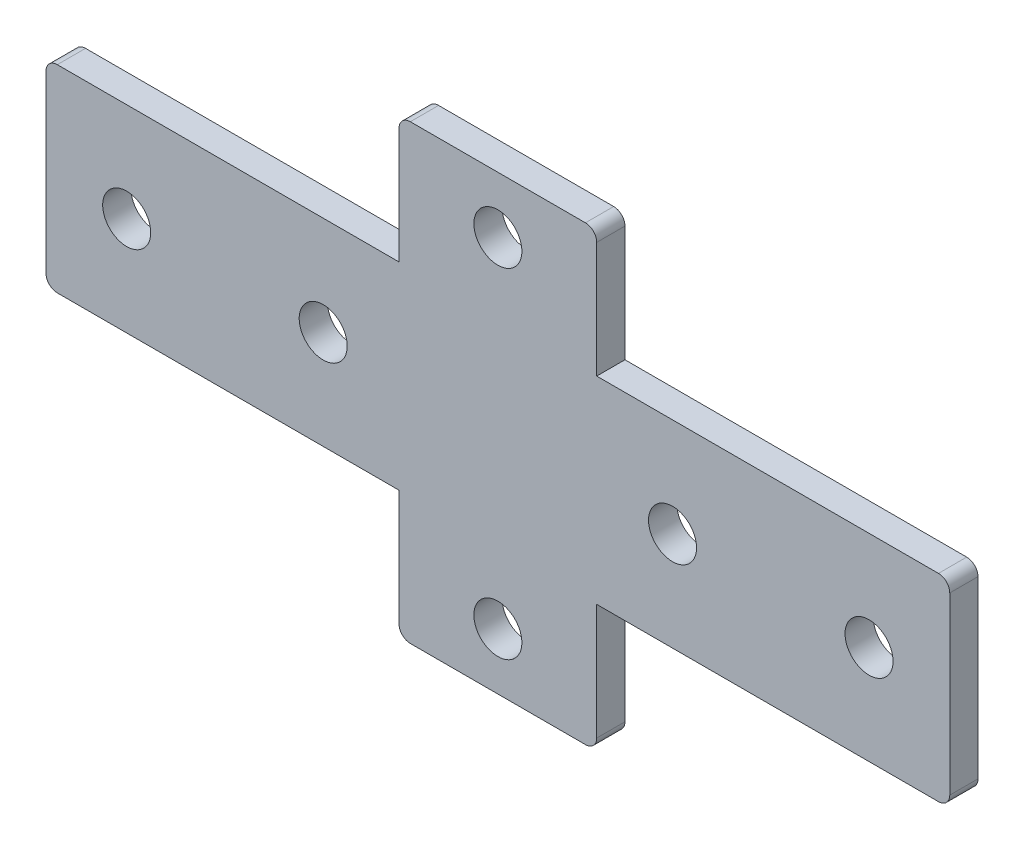
ISO-10303-21;
HEADER;
FILE_DESCRIPTION(('STEP AP214'),'2;1');
FILE_NAME('part.step','',(''),(''),'','','');
FILE_SCHEMA(('AUTOMOTIVE_DESIGN { 1 0 10303 214 1 1 1 1 }'));
ENDSEC;
DATA;
#1=APPLICATION_CONTEXT('core data for automotive mechanical design processes');
#2=APPLICATION_PROTOCOL_DEFINITION('international standard','automotive_design',2000,#1);
#3=PRODUCT_CONTEXT('',#1,'mechanical');
#4=PRODUCT('Part','Part','',(#3));
#5=PRODUCT_RELATED_PRODUCT_CATEGORY('part','',(#4));
#6=PRODUCT_DEFINITION_FORMATION('','',#4);
#7=PRODUCT_DEFINITION_CONTEXT('part definition',#1,'design');
#8=PRODUCT_DEFINITION('design','',#6,#7);
#9=PRODUCT_DEFINITION_SHAPE('','',#8);
#10=(LENGTH_UNIT() NAMED_UNIT(*) SI_UNIT(.MILLI.,.METRE.));
#11=(NAMED_UNIT(*) PLANE_ANGLE_UNIT() SI_UNIT($,.RADIAN.));
#12=(NAMED_UNIT(*) SI_UNIT($,.STERADIAN.) SOLID_ANGLE_UNIT());
#13=UNCERTAINTY_MEASURE_WITH_UNIT(LENGTH_MEASURE(1.E-05),#10,'distance_accuracy_value','');
#14=(GEOMETRIC_REPRESENTATION_CONTEXT(3) GLOBAL_UNCERTAINTY_ASSIGNED_CONTEXT((#13)) GLOBAL_UNIT_ASSIGNED_CONTEXT((#10,
#11,#12)) REPRESENTATION_CONTEXT('',''));
#15=CARTESIAN_POINT('',(0.,0.,0.));
#16=DIRECTION('',(0.,0.,1.));
#17=DIRECTION('',(1.,0.,0.));
#18=AXIS2_PLACEMENT_3D('',#15,#16,#17);
#19=CARTESIAN_POINT('',(80.,17.5,5.));
#20=DIRECTION('',(0.,0.,-1.));
#21=DIRECTION('',(-1.,0.,0.));
#22=AXIS2_PLACEMENT_3D('',#19,#20,#21);
#23=PLANE('',#22);
#24=CARTESIAN_POINT('',(65.7128235473032,0.,5.));
#25=DIRECTION('',(0.,0.,-1.));
#26=DIRECTION('',(-1.,0.,0.));
#27=AXIS2_PLACEMENT_3D('',#24,#25,#26);
#28=CIRCLE('',#27,4.25000000000001);
#29=CARTESIAN_POINT('',(61.4628235473032,0.,5.));
#30=VERTEX_POINT('',#29);
#31=EDGE_CURVE('E406',#30,#30,#28,.T.);
#32=ORIENTED_EDGE('',*,*,#31,.T.);
#33=EDGE_LOOP('',(#32));
#34=FACE_BOUND('',#33,.T.);
#35=DIRECTION('',(-1.,0.,0.));
#36=VECTOR('',#35,1.);
#37=CARTESIAN_POINT('',(-17.5,40.,5.));
#38=LINE('',#37,#36);
#39=CARTESIAN_POINT('',(15.5,40.,5.));
#40=VERTEX_POINT('',#39);
#41=CARTESIAN_POINT('',(-15.5,40.,5.));
#42=VERTEX_POINT('',#41);
#43=EDGE_CURVE('E199',#40,#42,#38,.T.);
#44=ORIENTED_EDGE('',*,*,#43,.T.);
#45=CARTESIAN_POINT('',(-15.5,38.,5.));
#46=DIRECTION('',(0.,0.,-1.));
#47=DIRECTION('',(-1.,0.,0.));
#48=AXIS2_PLACEMENT_3D('',#45,#46,#47);
#49=CIRCLE('',#48,2.);
#50=CARTESIAN_POINT('',(-17.5,38.,5.));
#51=VERTEX_POINT('',#50);
#52=EDGE_CURVE('E296',#42,#51,#49,.F.);
#53=ORIENTED_EDGE('',*,*,#52,.T.);
#54=DIRECTION('',(0.,-1.,0.));
#55=VECTOR('',#54,1.);
#56=CARTESIAN_POINT('',(-17.5,17.5,5.));
#57=LINE('',#56,#55);
#58=CARTESIAN_POINT('',(-17.5,17.5,5.));
#59=VERTEX_POINT('',#58);
#60=EDGE_CURVE('E201',#51,#59,#57,.T.);
#61=ORIENTED_EDGE('',*,*,#60,.T.);
#62=DIRECTION('',(-1.,0.,0.));
#63=VECTOR('',#62,1.);
#64=CARTESIAN_POINT('',(-80.,17.5,5.));
#65=LINE('',#64,#63);
#66=CARTESIAN_POINT('',(-78.,17.5,5.));
#67=VERTEX_POINT('',#66);
#68=EDGE_CURVE('E206',#59,#67,#65,.T.);
#69=ORIENTED_EDGE('',*,*,#68,.T.);
#70=CARTESIAN_POINT('',(-78.,15.5,5.));
#71=DIRECTION('',(0.,0.,-1.));
#72=DIRECTION('',(-1.,0.,0.));
#73=AXIS2_PLACEMENT_3D('',#70,#71,#72);
#74=CIRCLE('',#73,2.);
#75=CARTESIAN_POINT('',(-80.,15.5,5.));
#76=VERTEX_POINT('',#75);
#77=EDGE_CURVE('E286',#67,#76,#74,.F.);
#78=ORIENTED_EDGE('',*,*,#77,.T.);
#79=DIRECTION('',(0.,-1.,0.));
#80=VECTOR('',#79,1.);
#81=CARTESIAN_POINT('',(-80.,-17.5,5.));
#82=LINE('',#81,#80);
#83=CARTESIAN_POINT('',(-80.,-15.5,5.));
#84=VERTEX_POINT('',#83);
#85=EDGE_CURVE('E209',#76,#84,#82,.T.);
#86=ORIENTED_EDGE('',*,*,#85,.T.);
#87=CARTESIAN_POINT('',(-78.,-15.5,5.));
#88=DIRECTION('',(0.,0.,-1.));
#89=DIRECTION('',(-1.,0.,0.));
#90=AXIS2_PLACEMENT_3D('',#87,#88,#89);
#91=CIRCLE('',#90,2.);
#92=CARTESIAN_POINT('',(-78.,-17.5,5.));
#93=VERTEX_POINT('',#92);
#94=EDGE_CURVE('E284',#84,#93,#91,.F.);
#95=ORIENTED_EDGE('',*,*,#94,.T.);
#96=DIRECTION('',(1.,0.,0.));
#97=VECTOR('',#96,1.);
#98=CARTESIAN_POINT('',(-80.,-17.5,5.));
#99=LINE('',#98,#97);
#100=CARTESIAN_POINT('',(-17.5,-17.5,5.));
#101=VERTEX_POINT('',#100);
#102=EDGE_CURVE('E212',#93,#101,#99,.T.);
#103=ORIENTED_EDGE('',*,*,#102,.T.);
#104=DIRECTION('',(0.,-1.,0.));
#105=VECTOR('',#104,1.);
#106=CARTESIAN_POINT('',(-17.5,-40.,5.));
#107=LINE('',#106,#105);
#108=CARTESIAN_POINT('',(-17.5,-38.,5.));
#109=VERTEX_POINT('',#108);
#110=EDGE_CURVE('E214',#101,#109,#107,.T.);
#111=ORIENTED_EDGE('',*,*,#110,.T.);
#112=CARTESIAN_POINT('',(-15.5,-38.,5.));
#113=DIRECTION('',(0.,0.,-1.));
#114=DIRECTION('',(-1.,0.,0.));
#115=AXIS2_PLACEMENT_3D('',#112,#113,#114);
#116=CIRCLE('',#115,2.);
#117=CARTESIAN_POINT('',(-15.5,-40.,5.));
#118=VERTEX_POINT('',#117);
#119=EDGE_CURVE('E288',#109,#118,#116,.F.);
#120=ORIENTED_EDGE('',*,*,#119,.T.);
#121=DIRECTION('',(1.,0.,0.));
#122=VECTOR('',#121,1.);
#123=CARTESIAN_POINT('',(-17.5,-40.,5.));
#124=LINE('',#123,#122);
#125=CARTESIAN_POINT('',(15.5,-40.,5.));
#126=VERTEX_POINT('',#125);
#127=EDGE_CURVE('E217',#118,#126,#124,.T.);
#128=ORIENTED_EDGE('',*,*,#127,.T.);
#129=CARTESIAN_POINT('',(15.5,-38.,5.));
#130=DIRECTION('',(0.,0.,-1.));
#131=DIRECTION('',(-1.,0.,0.));
#132=AXIS2_PLACEMENT_3D('',#129,#130,#131);
#133=CIRCLE('',#132,2.);
#134=CARTESIAN_POINT('',(17.5,-38.,5.));
#135=VERTEX_POINT('',#134);
#136=EDGE_CURVE('E54',#126,#135,#133,.F.);
#137=ORIENTED_EDGE('',*,*,#136,.T.);
#138=DIRECTION('',(0.,1.,0.));
#139=VECTOR('',#138,1.);
#140=CARTESIAN_POINT('',(17.5,-40.,5.));
#141=LINE('',#140,#139);
#142=CARTESIAN_POINT('',(17.5,-17.5,5.));
#143=VERTEX_POINT('',#142);
#144=EDGE_CURVE('E219',#135,#143,#141,.T.);
#145=ORIENTED_EDGE('',*,*,#144,.T.);
#146=DIRECTION('',(1.,0.,0.));
#147=VECTOR('',#146,1.);
#148=CARTESIAN_POINT('',(17.5,-17.5,5.));
#149=LINE('',#148,#147);
#150=CARTESIAN_POINT('',(78.,-17.5,5.));
#151=VERTEX_POINT('',#150);
#152=EDGE_CURVE('E221',#143,#151,#149,.T.);
#153=ORIENTED_EDGE('',*,*,#152,.T.);
#154=CARTESIAN_POINT('',(78.,-15.5,5.));
#155=DIRECTION('',(0.,0.,-1.));
#156=DIRECTION('',(-1.,0.,0.));
#157=AXIS2_PLACEMENT_3D('',#154,#155,#156);
#158=CIRCLE('',#157,2.);
#159=CARTESIAN_POINT('',(80.,-15.5,5.));
#160=VERTEX_POINT('',#159);
#161=EDGE_CURVE('E291',#151,#160,#158,.F.);
#162=ORIENTED_EDGE('',*,*,#161,.T.);
#163=DIRECTION('',(0.,1.,0.));
#164=VECTOR('',#163,1.);
#165=CARTESIAN_POINT('',(80.,-17.5,5.));
#166=LINE('',#165,#164);
#167=CARTESIAN_POINT('',(80.,15.5,5.));
#168=VERTEX_POINT('',#167);
#169=EDGE_CURVE('E183',#160,#168,#166,.T.);
#170=ORIENTED_EDGE('',*,*,#169,.T.);
#171=CARTESIAN_POINT('',(78.,15.5,5.));
#172=DIRECTION('',(0.,0.,-1.));
#173=DIRECTION('',(-1.,0.,0.));
#174=AXIS2_PLACEMENT_3D('',#171,#172,#173);
#175=CIRCLE('',#174,2.);
#176=CARTESIAN_POINT('',(78.,17.5,5.));
#177=VERTEX_POINT('',#176);
#178=EDGE_CURVE('E179',#168,#177,#175,.F.);
#179=ORIENTED_EDGE('',*,*,#178,.T.);
#180=DIRECTION('',(-1.,0.,0.));
#181=VECTOR('',#180,1.);
#182=CARTESIAN_POINT('',(17.5,17.5,5.));
#183=LINE('',#182,#181);
#184=CARTESIAN_POINT('',(17.5,17.5,5.));
#185=VERTEX_POINT('',#184);
#186=EDGE_CURVE('E170',#177,#185,#183,.T.);
#187=ORIENTED_EDGE('',*,*,#186,.T.);
#188=DIRECTION('',(0.,1.,0.));
#189=VECTOR('',#188,1.);
#190=CARTESIAN_POINT('',(17.5,17.5,5.));
#191=LINE('',#190,#189);
#192=CARTESIAN_POINT('',(17.5,38.,5.));
#193=VERTEX_POINT('',#192);
#194=EDGE_CURVE('E175',#185,#193,#191,.T.);
#195=ORIENTED_EDGE('',*,*,#194,.T.);
#196=CARTESIAN_POINT('',(15.5,38.,5.));
#197=DIRECTION('',(0.,0.,-1.));
#198=DIRECTION('',(-1.,0.,0.));
#199=AXIS2_PLACEMENT_3D('',#196,#197,#198);
#200=CIRCLE('',#199,2.);
#201=EDGE_CURVE('E294',#193,#40,#200,.F.);
#202=ORIENTED_EDGE('',*,*,#201,.T.);
#203=EDGE_LOOP('',(#44,#53,#61,#69,#78,#86,#95,#103,#111,#120,#128,#137,#145,#153,#162,#170,
#179,#187,#195,#202));
#204=FACE_BOUND('',#203,.T.);
#205=CARTESIAN_POINT('',(0.,30.,5.));
#206=DIRECTION('',(0.,0.,1.));
#207=DIRECTION('',(1.,0.,0.));
#208=AXIS2_PLACEMENT_3D('',#205,#206,#207);
#209=CIRCLE('',#208,4.25);
#210=CARTESIAN_POINT('',(4.25,30.,5.));
#211=VERTEX_POINT('',#210);
#212=EDGE_CURVE('E382',#211,#211,#209,.T.);
#213=ORIENTED_EDGE('',*,*,#212,.F.);
#214=EDGE_LOOP('',(#213));
#215=FACE_BOUND('',#214,.T.);
#216=CARTESIAN_POINT('',(-65.7128235473032,0.,5.));
#217=DIRECTION('',(0.,0.,1.));
#218=DIRECTION('',(1.,0.,0.));
#219=AXIS2_PLACEMENT_3D('',#216,#217,#218);
#220=CIRCLE('',#219,4.25000000000001);
#221=CARTESIAN_POINT('',(-61.4628235473032,0.,5.));
#222=VERTEX_POINT('',#221);
#223=EDGE_CURVE('E388',#222,#222,#220,.T.);
#224=ORIENTED_EDGE('',*,*,#223,.F.);
#225=EDGE_LOOP('',(#224));
#226=FACE_BOUND('',#225,.T.);
#227=CARTESIAN_POINT('',(-30.9233783227885,0.,5.));
#228=DIRECTION('',(0.,0.,1.));
#229=DIRECTION('',(1.,0.,0.));
#230=AXIS2_PLACEMENT_3D('',#227,#228,#229);
#231=CIRCLE('',#230,4.25);
#232=CARTESIAN_POINT('',(-26.6733783227885,0.,5.));
#233=VERTEX_POINT('',#232);
#234=EDGE_CURVE('E394',#233,#233,#231,.T.);
#235=ORIENTED_EDGE('',*,*,#234,.F.);
#236=EDGE_LOOP('',(#235));
#237=FACE_BOUND('',#236,.T.);
#238=CARTESIAN_POINT('',(0.,-30.,5.));
#239=DIRECTION('',(0.,0.,-1.));
#240=DIRECTION('',(1.,0.,0.));
#241=AXIS2_PLACEMENT_3D('',#238,#239,#240);
#242=CIRCLE('',#241,4.25);
#243=CARTESIAN_POINT('',(4.25,-30.,5.));
#244=VERTEX_POINT('',#243);
#245=EDGE_CURVE('E400',#244,#244,#242,.T.);
#246=ORIENTED_EDGE('',*,*,#245,.T.);
#247=EDGE_LOOP('',(#246));
#248=FACE_BOUND('',#247,.T.);
#249=CARTESIAN_POINT('',(30.9233783227885,0.,5.));
#250=DIRECTION('',(0.,0.,-1.));
#251=DIRECTION('',(-1.,0.,0.));
#252=AXIS2_PLACEMENT_3D('',#249,#250,#251);
#253=CIRCLE('',#252,4.25);
#254=CARTESIAN_POINT('',(26.6733783227885,0.,5.));
#255=VERTEX_POINT('',#254);
#256=EDGE_CURVE('E412',#255,#255,#253,.T.);
#257=ORIENTED_EDGE('',*,*,#256,.T.);
#258=EDGE_LOOP('',(#257));
#259=FACE_BOUND('',#258,.T.);
#260=ADVANCED_FACE('F31',(#34,#204,#215,#226,#237,#248,#259),#23,.F.);
#261=CARTESIAN_POINT('',(80.,17.5,0.));
#262=DIRECTION('',(0.,0.,-1.));
#263=DIRECTION('',(-1.,0.,0.));
#264=AXIS2_PLACEMENT_3D('',#261,#262,#263);
#265=PLANE('',#264);
#266=CARTESIAN_POINT('',(65.7128235473032,0.,0.));
#267=DIRECTION('',(0.,0.,-1.));
#268=DIRECTION('',(-1.,0.,0.));
#269=AXIS2_PLACEMENT_3D('',#266,#267,#268);
#270=CIRCLE('',#269,4.25000000000001);
#271=CARTESIAN_POINT('',(61.4628235473032,0.,0.));
#272=VERTEX_POINT('',#271);
#273=EDGE_CURVE('E403',#272,#272,#270,.T.);
#274=ORIENTED_EDGE('',*,*,#273,.F.);
#275=EDGE_LOOP('',(#274));
#276=FACE_BOUND('',#275,.T.);
#277=DIRECTION('',(0.,-1.,0.));
#278=VECTOR('',#277,1.);
#279=CARTESIAN_POINT('',(-17.5,17.5,0.));
#280=LINE('',#279,#278);
#281=CARTESIAN_POINT('',(-17.5,38.,0.));
#282=VERTEX_POINT('',#281);
#283=CARTESIAN_POINT('',(-17.5,17.5,0.));
#284=VERTEX_POINT('',#283);
#285=EDGE_CURVE('E234',#282,#284,#280,.T.);
#286=ORIENTED_EDGE('',*,*,#285,.F.);
#287=CARTESIAN_POINT('',(-15.5,38.,0.));
#288=DIRECTION('',(0.,0.,-1.));
#289=DIRECTION('',(-1.,0.,0.));
#290=AXIS2_PLACEMENT_3D('',#287,#288,#289);
#291=CIRCLE('',#290,2.);
#292=CARTESIAN_POINT('',(-15.5,40.,0.));
#293=VERTEX_POINT('',#292);
#294=EDGE_CURVE('E277',#282,#293,#291,.T.);
#295=ORIENTED_EDGE('',*,*,#294,.T.);
#296=DIRECTION('',(-1.,0.,0.));
#297=VECTOR('',#296,1.);
#298=CARTESIAN_POINT('',(-17.5,40.,0.));
#299=LINE('',#298,#297);
#300=CARTESIAN_POINT('',(15.5,40.,0.));
#301=VERTEX_POINT('',#300);
#302=EDGE_CURVE('E231',#301,#293,#299,.T.);
#303=ORIENTED_EDGE('',*,*,#302,.F.);
#304=CARTESIAN_POINT('',(15.5,38.,0.));
#305=DIRECTION('',(0.,0.,-1.));
#306=DIRECTION('',(-1.,0.,0.));
#307=AXIS2_PLACEMENT_3D('',#304,#305,#306);
#308=CIRCLE('',#307,2.);
#309=CARTESIAN_POINT('',(17.5,38.,0.));
#310=VERTEX_POINT('',#309);
#311=EDGE_CURVE('E275',#301,#310,#308,.T.);
#312=ORIENTED_EDGE('',*,*,#311,.T.);
#313=DIRECTION('',(0.,1.,0.));
#314=VECTOR('',#313,1.);
#315=CARTESIAN_POINT('',(17.5,17.5,0.));
#316=LINE('',#315,#314);
#317=CARTESIAN_POINT('',(17.5,17.5,0.));
#318=VERTEX_POINT('',#317);
#319=EDGE_CURVE('E229',#318,#310,#316,.T.);
#320=ORIENTED_EDGE('',*,*,#319,.F.);
#321=DIRECTION('',(-1.,0.,0.));
#322=VECTOR('',#321,1.);
#323=CARTESIAN_POINT('',(17.5,17.5,0.));
#324=LINE('',#323,#322);
#325=CARTESIAN_POINT('',(78.,17.5,0.));
#326=VERTEX_POINT('',#325);
#327=EDGE_CURVE('E189',#326,#318,#324,.T.);
#328=ORIENTED_EDGE('',*,*,#327,.F.);
#329=CARTESIAN_POINT('',(78.,15.5,0.));
#330=DIRECTION('',(0.,0.,-1.));
#331=DIRECTION('',(-1.,0.,0.));
#332=AXIS2_PLACEMENT_3D('',#329,#330,#331);
#333=CIRCLE('',#332,2.);
#334=CARTESIAN_POINT('',(80.,15.5,0.));
#335=VERTEX_POINT('',#334);
#336=EDGE_CURVE('E273',#326,#335,#333,.T.);
#337=ORIENTED_EDGE('',*,*,#336,.T.);
#338=DIRECTION('',(0.,1.,0.));
#339=VECTOR('',#338,1.);
#340=CARTESIAN_POINT('',(80.,-17.5,0.));
#341=LINE('',#340,#339);
#342=CARTESIAN_POINT('',(80.,-15.5,0.));
#343=VERTEX_POINT('',#342);
#344=EDGE_CURVE('E224',#343,#335,#341,.T.);
#345=ORIENTED_EDGE('',*,*,#344,.F.);
#346=CARTESIAN_POINT('',(78.,-15.5,0.));
#347=DIRECTION('',(0.,0.,-1.));
#348=DIRECTION('',(-1.,0.,0.));
#349=AXIS2_PLACEMENT_3D('',#346,#347,#348);
#350=CIRCLE('',#349,2.);
#351=CARTESIAN_POINT('',(78.,-17.5,0.));
#352=VERTEX_POINT('',#351);
#353=EDGE_CURVE('E271',#343,#352,#350,.T.);
#354=ORIENTED_EDGE('',*,*,#353,.T.);
#355=DIRECTION('',(1.,0.,0.));
#356=VECTOR('',#355,1.);
#357=CARTESIAN_POINT('',(17.5,-17.5,0.));
#358=LINE('',#357,#356);
#359=CARTESIAN_POINT('',(17.5,-17.5,0.));
#360=VERTEX_POINT('',#359);
#361=EDGE_CURVE('E252',#360,#352,#358,.T.);
#362=ORIENTED_EDGE('',*,*,#361,.F.);
#363=DIRECTION('',(0.,1.,0.));
#364=VECTOR('',#363,1.);
#365=CARTESIAN_POINT('',(17.5,-40.,0.));
#366=LINE('',#365,#364);
#367=CARTESIAN_POINT('',(17.5,-38.,0.));
#368=VERTEX_POINT('',#367);
#369=EDGE_CURVE('E250',#368,#360,#366,.T.);
#370=ORIENTED_EDGE('',*,*,#369,.F.);
#371=CARTESIAN_POINT('',(15.5,-38.,0.));
#372=DIRECTION('',(0.,0.,-1.));
#373=DIRECTION('',(-1.,0.,0.));
#374=AXIS2_PLACEMENT_3D('',#371,#372,#373);
#375=CIRCLE('',#374,2.);
#376=CARTESIAN_POINT('',(15.5,-40.,0.));
#377=VERTEX_POINT('',#376);
#378=EDGE_CURVE('E269',#368,#377,#375,.T.);
#379=ORIENTED_EDGE('',*,*,#378,.T.);
#380=DIRECTION('',(1.,0.,0.));
#381=VECTOR('',#380,1.);
#382=CARTESIAN_POINT('',(-17.5,-40.,0.));
#383=LINE('',#382,#381);
#384=CARTESIAN_POINT('',(-15.5,-40.,0.));
#385=VERTEX_POINT('',#384);
#386=EDGE_CURVE('E247',#385,#377,#383,.T.);
#387=ORIENTED_EDGE('',*,*,#386,.F.);
#388=CARTESIAN_POINT('',(-15.5,-38.,0.));
#389=DIRECTION('',(0.,0.,-1.));
#390=DIRECTION('',(-1.,0.,0.));
#391=AXIS2_PLACEMENT_3D('',#388,#389,#390);
#392=CIRCLE('',#391,2.);
#393=CARTESIAN_POINT('',(-17.5,-38.,0.));
#394=VERTEX_POINT('',#393);
#395=EDGE_CURVE('E267',#385,#394,#392,.T.);
#396=ORIENTED_EDGE('',*,*,#395,.T.);
#397=DIRECTION('',(0.,-1.,0.));
#398=VECTOR('',#397,1.);
#399=CARTESIAN_POINT('',(-17.5,-40.,0.));
#400=LINE('',#399,#398);
#401=CARTESIAN_POINT('',(-17.5,-17.5,0.));
#402=VERTEX_POINT('',#401);
#403=EDGE_CURVE('E244',#402,#394,#400,.T.);
#404=ORIENTED_EDGE('',*,*,#403,.F.);
#405=DIRECTION('',(1.,0.,0.));
#406=VECTOR('',#405,1.);
#407=CARTESIAN_POINT('',(-80.,-17.5,0.));
#408=LINE('',#407,#406);
#409=CARTESIAN_POINT('',(-78.,-17.5,0.));
#410=VERTEX_POINT('',#409);
#411=EDGE_CURVE('E242',#410,#402,#408,.T.);
#412=ORIENTED_EDGE('',*,*,#411,.F.);
#413=CARTESIAN_POINT('',(-78.,-15.5,0.));
#414=DIRECTION('',(0.,0.,-1.));
#415=DIRECTION('',(-1.,0.,0.));
#416=AXIS2_PLACEMENT_3D('',#413,#414,#415);
#417=CIRCLE('',#416,2.);
#418=CARTESIAN_POINT('',(-80.,-15.5,0.));
#419=VERTEX_POINT('',#418);
#420=EDGE_CURVE('E263',#410,#419,#417,.T.);
#421=ORIENTED_EDGE('',*,*,#420,.T.);
#422=DIRECTION('',(0.,-1.,0.));
#423=VECTOR('',#422,1.);
#424=CARTESIAN_POINT('',(-80.,-17.5,0.));
#425=LINE('',#424,#423);
#426=CARTESIAN_POINT('',(-80.,15.5,0.));
#427=VERTEX_POINT('',#426);
#428=EDGE_CURVE('E239',#427,#419,#425,.T.);
#429=ORIENTED_EDGE('',*,*,#428,.F.);
#430=CARTESIAN_POINT('',(-78.,15.5,0.));
#431=DIRECTION('',(0.,0.,-1.));
#432=DIRECTION('',(-1.,0.,0.));
#433=AXIS2_PLACEMENT_3D('',#430,#431,#432);
#434=CIRCLE('',#433,2.);
#435=CARTESIAN_POINT('',(-78.,17.5,0.));
#436=VERTEX_POINT('',#435);
#437=EDGE_CURVE('E265',#427,#436,#434,.T.);
#438=ORIENTED_EDGE('',*,*,#437,.T.);
#439=DIRECTION('',(-1.,0.,0.));
#440=VECTOR('',#439,1.);
#441=CARTESIAN_POINT('',(-80.,17.5,0.));
#442=LINE('',#441,#440);
#443=EDGE_CURVE('E236',#284,#436,#442,.T.);
#444=ORIENTED_EDGE('',*,*,#443,.F.);
#445=EDGE_LOOP('',(#286,#295,#303,#312,#320,#328,#337,#345,#354,#362,#370,#379,#387,#396,#404,
#412,#421,#429,#438,#444));
#446=FACE_BOUND('',#445,.T.);
#447=CARTESIAN_POINT('',(0.,30.,0.));
#448=DIRECTION('',(0.,0.,1.));
#449=DIRECTION('',(1.,0.,0.));
#450=AXIS2_PLACEMENT_3D('',#447,#448,#449);
#451=CIRCLE('',#450,4.25);
#452=CARTESIAN_POINT('',(4.25,30.,0.));
#453=VERTEX_POINT('',#452);
#454=EDGE_CURVE('E227',#453,#453,#451,.T.);
#455=ORIENTED_EDGE('',*,*,#454,.T.);
#456=EDGE_LOOP('',(#455));
#457=FACE_BOUND('',#456,.T.);
#458=CARTESIAN_POINT('',(-65.7128235473032,0.,0.));
#459=DIRECTION('',(0.,0.,1.));
#460=DIRECTION('',(1.,0.,0.));
#461=AXIS2_PLACEMENT_3D('',#458,#459,#460);
#462=CIRCLE('',#461,4.25000000000001);
#463=CARTESIAN_POINT('',(-61.4628235473032,0.,0.));
#464=VERTEX_POINT('',#463);
#465=EDGE_CURVE('E385',#464,#464,#462,.T.);
#466=ORIENTED_EDGE('',*,*,#465,.T.);
#467=EDGE_LOOP('',(#466));
#468=FACE_BOUND('',#467,.T.);
#469=CARTESIAN_POINT('',(-30.9233783227885,0.,0.));
#470=DIRECTION('',(0.,0.,1.));
#471=DIRECTION('',(1.,0.,0.));
#472=AXIS2_PLACEMENT_3D('',#469,#470,#471);
#473=CIRCLE('',#472,4.25);
#474=CARTESIAN_POINT('',(-26.6733783227885,0.,0.));
#475=VERTEX_POINT('',#474);
#476=EDGE_CURVE('E391',#475,#475,#473,.T.);
#477=ORIENTED_EDGE('',*,*,#476,.T.);
#478=EDGE_LOOP('',(#477));
#479=FACE_BOUND('',#478,.T.);
#480=CARTESIAN_POINT('',(0.,-30.,0.));
#481=DIRECTION('',(0.,0.,-1.));
#482=DIRECTION('',(1.,0.,0.));
#483=AXIS2_PLACEMENT_3D('',#480,#481,#482);
#484=CIRCLE('',#483,4.25);
#485=CARTESIAN_POINT('',(4.25,-30.,0.));
#486=VERTEX_POINT('',#485);
#487=EDGE_CURVE('E397',#486,#486,#484,.T.);
#488=ORIENTED_EDGE('',*,*,#487,.F.);
#489=EDGE_LOOP('',(#488));
#490=FACE_BOUND('',#489,.T.);
#491=CARTESIAN_POINT('',(30.9233783227885,0.,0.));
#492=DIRECTION('',(0.,0.,-1.));
#493=DIRECTION('',(-1.,0.,0.));
#494=AXIS2_PLACEMENT_3D('',#491,#492,#493);
#495=CIRCLE('',#494,4.25);
#496=CARTESIAN_POINT('',(26.6733783227885,0.,0.));
#497=VERTEX_POINT('',#496);
#498=EDGE_CURVE('E409',#497,#497,#495,.T.);
#499=ORIENTED_EDGE('',*,*,#498,.F.);
#500=EDGE_LOOP('',(#499));
#501=FACE_BOUND('',#500,.T.);
#502=ADVANCED_FACE('F339',(#276,#446,#457,#468,#479,#490,#501),#265,.T.);
#503=CARTESIAN_POINT('',(80.,-17.5,5.));
#504=DIRECTION('',(-1.,0.,0.));
#505=DIRECTION('',(0.,0.,1.));
#506=AXIS2_PLACEMENT_3D('',#503,#504,#505);
#507=PLANE('',#506);
#508=ORIENTED_EDGE('',*,*,#344,.T.);
#509=DIRECTION('',(0.,0.,-1.));
#510=VECTOR('',#509,1.);
#511=CARTESIAN_POINT('',(80.,15.5,5.));
#512=LINE('',#511,#510);
#513=EDGE_CURVE('E304',#335,#168,#512,.F.);
#514=ORIENTED_EDGE('',*,*,#513,.T.);
#515=ORIENTED_EDGE('',*,*,#169,.F.);
#516=DIRECTION('',(0.,0.,-1.));
#517=VECTOR('',#516,1.);
#518=CARTESIAN_POINT('',(80.,-15.5,5.));
#519=LINE('',#518,#517);
#520=EDGE_CURVE('E301',#160,#343,#519,.T.);
#521=ORIENTED_EDGE('',*,*,#520,.T.);
#522=EDGE_LOOP('',(#508,#514,#515,#521));
#523=FACE_BOUND('',#522,.T.);
#524=ADVANCED_FACE('F377',(#523),#507,.F.);
#525=CARTESIAN_POINT('',(17.5,17.5,5.));
#526=DIRECTION('',(0.,-1.,0.));
#527=DIRECTION('',(0.,0.,-1.));
#528=AXIS2_PLACEMENT_3D('',#525,#526,#527);
#529=PLANE('',#528);
#530=ORIENTED_EDGE('',*,*,#186,.F.);
#531=DIRECTION('',(0.,0.,-1.));
#532=VECTOR('',#531,1.);
#533=CARTESIAN_POINT('',(78.,17.5,5.));
#534=LINE('',#533,#532);
#535=EDGE_CURVE('E299',#177,#326,#534,.T.);
#536=ORIENTED_EDGE('',*,*,#535,.T.);
#537=ORIENTED_EDGE('',*,*,#327,.T.);
#538=DIRECTION('',(0.,0.,-1.));
#539=VECTOR('',#538,1.);
#540=CARTESIAN_POINT('',(17.5,17.5,5.));
#541=LINE('',#540,#539);
#542=EDGE_CURVE('E186',#185,#318,#541,.T.);
#543=ORIENTED_EDGE('',*,*,#542,.F.);
#544=EDGE_LOOP('',(#530,#536,#537,#543));
#545=FACE_BOUND('',#544,.T.);
#546=ADVANCED_FACE('F187',(#545),#529,.F.);
#547=CARTESIAN_POINT('',(17.5,17.5,5.));
#548=DIRECTION('',(-1.,0.,0.));
#549=DIRECTION('',(0.,0.,1.));
#550=AXIS2_PLACEMENT_3D('',#547,#548,#549);
#551=PLANE('',#550);
#552=ORIENTED_EDGE('',*,*,#319,.T.);
#553=DIRECTION('',(0.,0.,-1.));
#554=VECTOR('',#553,1.);
#555=CARTESIAN_POINT('',(17.5,38.,5.));
#556=LINE('',#555,#554);
#557=EDGE_CURVE('E198',#310,#193,#556,.F.);
#558=ORIENTED_EDGE('',*,*,#557,.T.);
#559=ORIENTED_EDGE('',*,*,#194,.F.);
#560=ORIENTED_EDGE('',*,*,#542,.T.);
#561=EDGE_LOOP('',(#552,#558,#559,#560));
#562=FACE_BOUND('',#561,.T.);
#563=ADVANCED_FACE('F196',(#562),#551,.F.);
#564=CARTESIAN_POINT('',(-17.5,40.,5.));
#565=DIRECTION('',(0.,-1.,0.));
#566=DIRECTION('',(0.,0.,-1.));
#567=AXIS2_PLACEMENT_3D('',#564,#565,#566);
#568=PLANE('',#567);
#569=ORIENTED_EDGE('',*,*,#302,.T.);
#570=DIRECTION('',(0.,0.,-1.));
#571=VECTOR('',#570,1.);
#572=CARTESIAN_POINT('',(-15.5,40.,5.));
#573=LINE('',#572,#571);
#574=EDGE_CURVE('E282',#293,#42,#573,.F.);
#575=ORIENTED_EDGE('',*,*,#574,.T.);
#576=ORIENTED_EDGE('',*,*,#43,.F.);
#577=DIRECTION('',(0.,0.,-1.));
#578=VECTOR('',#577,1.);
#579=CARTESIAN_POINT('',(15.5,40.,5.));
#580=LINE('',#579,#578);
#581=EDGE_CURVE('E279',#40,#301,#580,.T.);
#582=ORIENTED_EDGE('',*,*,#581,.T.);
#583=EDGE_LOOP('',(#569,#575,#576,#582));
#584=FACE_BOUND('',#583,.T.);
#585=ADVANCED_FACE('F454',(#584),#568,.F.);
#586=CARTESIAN_POINT('',(-17.5,17.5,5.));
#587=DIRECTION('',(1.,0.,0.));
#588=DIRECTION('',(0.,0.,-1.));
#589=AXIS2_PLACEMENT_3D('',#586,#587,#588);
#590=PLANE('',#589);
#591=ORIENTED_EDGE('',*,*,#60,.F.);
#592=DIRECTION('',(0.,0.,-1.));
#593=VECTOR('',#592,1.);
#594=CARTESIAN_POINT('',(-17.5,38.,5.));
#595=LINE('',#594,#593);
#596=EDGE_CURVE('E193',#51,#282,#595,.T.);
#597=ORIENTED_EDGE('',*,*,#596,.T.);
#598=ORIENTED_EDGE('',*,*,#285,.T.);
#599=DIRECTION('',(0.,0.,-1.));
#600=VECTOR('',#599,1.);
#601=CARTESIAN_POINT('',(-17.5,17.5,5.));
#602=LINE('',#601,#600);
#603=EDGE_CURVE('E194',#59,#284,#602,.T.);
#604=ORIENTED_EDGE('',*,*,#603,.F.);
#605=EDGE_LOOP('',(#591,#597,#598,#604));
#606=FACE_BOUND('',#605,.T.);
#607=ADVANCED_FACE('F451',(#606),#590,.F.);
#608=CARTESIAN_POINT('',(-80.,17.5,5.));
#609=DIRECTION('',(0.,-1.,0.));
#610=DIRECTION('',(0.,0.,-1.));
#611=AXIS2_PLACEMENT_3D('',#608,#609,#610);
#612=PLANE('',#611);
#613=ORIENTED_EDGE('',*,*,#443,.T.);
#614=DIRECTION('',(0.,0.,-1.));
#615=VECTOR('',#614,1.);
#616=CARTESIAN_POINT('',(-78.,17.5,5.));
#617=LINE('',#616,#615);
#618=EDGE_CURVE('E39',#436,#67,#617,.F.);
#619=ORIENTED_EDGE('',*,*,#618,.T.);
#620=ORIENTED_EDGE('',*,*,#68,.F.);
#621=ORIENTED_EDGE('',*,*,#603,.T.);
#622=EDGE_LOOP('',(#613,#619,#620,#621));
#623=FACE_BOUND('',#622,.T.);
#624=ADVANCED_FACE('F324',(#623),#612,.F.);
#625=CARTESIAN_POINT('',(-80.,-17.5,5.));
#626=DIRECTION('',(1.,0.,0.));
#627=DIRECTION('',(0.,0.,-1.));
#628=AXIS2_PLACEMENT_3D('',#625,#626,#627);
#629=PLANE('',#628);
#630=ORIENTED_EDGE('',*,*,#85,.F.);
#631=DIRECTION('',(0.,0.,-1.));
#632=VECTOR('',#631,1.);
#633=CARTESIAN_POINT('',(-80.,15.5,5.));
#634=LINE('',#633,#632);
#635=EDGE_CURVE('E319',#76,#427,#634,.T.);
#636=ORIENTED_EDGE('',*,*,#635,.T.);
#637=ORIENTED_EDGE('',*,*,#428,.T.);
#638=DIRECTION('',(0.,0.,-1.));
#639=VECTOR('',#638,1.);
#640=CARTESIAN_POINT('',(-80.,-15.5,5.));
#641=LINE('',#640,#639);
#642=EDGE_CURVE('E317',#419,#84,#641,.F.);
#643=ORIENTED_EDGE('',*,*,#642,.T.);
#644=EDGE_LOOP('',(#630,#636,#637,#643));
#645=FACE_BOUND('',#644,.T.);
#646=ADVANCED_FACE('F335',(#645),#629,.F.);
#647=CARTESIAN_POINT('',(-80.,-17.5,5.));
#648=DIRECTION('',(0.,1.,0.));
#649=DIRECTION('',(-1.,0.,0.));
#650=AXIS2_PLACEMENT_3D('',#647,#648,#649);
#651=PLANE('',#650);
#652=ORIENTED_EDGE('',*,*,#102,.F.);
#653=DIRECTION('',(0.,0.,-1.));
#654=VECTOR('',#653,1.);
#655=CARTESIAN_POINT('',(-78.,-17.5,5.));
#656=LINE('',#655,#654);
#657=EDGE_CURVE('E11',#93,#410,#656,.T.);
#658=ORIENTED_EDGE('',*,*,#657,.T.);
#659=ORIENTED_EDGE('',*,*,#411,.T.);
#660=DIRECTION('',(0.,0.,-1.));
#661=VECTOR('',#660,1.);
#662=CARTESIAN_POINT('',(-17.5,-17.5,5.));
#663=LINE('',#662,#661);
#664=EDGE_CURVE('E256',#101,#402,#663,.T.);
#665=ORIENTED_EDGE('',*,*,#664,.F.);
#666=EDGE_LOOP('',(#652,#658,#659,#665));
#667=FACE_BOUND('',#666,.T.);
#668=ADVANCED_FACE('F348',(#667),#651,.F.);
#669=CARTESIAN_POINT('',(-17.5,-40.,5.));
#670=DIRECTION('',(1.,0.,0.));
#671=DIRECTION('',(0.,0.,-1.));
#672=AXIS2_PLACEMENT_3D('',#669,#670,#671);
#673=PLANE('',#672);
#674=ORIENTED_EDGE('',*,*,#403,.T.);
#675=DIRECTION('',(0.,0.,-1.));
#676=VECTOR('',#675,1.);
#677=CARTESIAN_POINT('',(-17.5,-38.,5.));
#678=LINE('',#677,#676);
#679=EDGE_CURVE('E315',#394,#109,#678,.F.);
#680=ORIENTED_EDGE('',*,*,#679,.T.);
#681=ORIENTED_EDGE('',*,*,#110,.F.);
#682=ORIENTED_EDGE('',*,*,#664,.T.);
#683=EDGE_LOOP('',(#674,#680,#681,#682));
#684=FACE_BOUND('',#683,.T.);
#685=ADVANCED_FACE('F442',(#684),#673,.F.);
#686=CARTESIAN_POINT('',(-17.5,-40.,5.));
#687=DIRECTION('',(0.,1.,0.));
#688=DIRECTION('',(0.,0.,1.));
#689=AXIS2_PLACEMENT_3D('',#686,#687,#688);
#690=PLANE('',#689);
#691=ORIENTED_EDGE('',*,*,#386,.T.);
#692=DIRECTION('',(0.,0.,-1.));
#693=VECTOR('',#692,1.);
#694=CARTESIAN_POINT('',(15.5,-40.,5.));
#695=LINE('',#694,#693);
#696=EDGE_CURVE('E313',#377,#126,#695,.F.);
#697=ORIENTED_EDGE('',*,*,#696,.T.);
#698=ORIENTED_EDGE('',*,*,#127,.F.);
#699=DIRECTION('',(0.,0.,-1.));
#700=VECTOR('',#699,1.);
#701=CARTESIAN_POINT('',(-15.5,-40.,5.));
#702=LINE('',#701,#700);
#703=EDGE_CURVE('E310',#118,#385,#702,.T.);
#704=ORIENTED_EDGE('',*,*,#703,.T.);
#705=EDGE_LOOP('',(#691,#697,#698,#704));
#706=FACE_BOUND('',#705,.T.);
#707=ADVANCED_FACE('F360',(#706),#690,.F.);
#708=CARTESIAN_POINT('',(17.5,-40.,5.));
#709=DIRECTION('',(-1.,0.,0.));
#710=DIRECTION('',(0.,-1.,0.));
#711=AXIS2_PLACEMENT_3D('',#708,#709,#710);
#712=PLANE('',#711);
#713=ORIENTED_EDGE('',*,*,#144,.F.);
#714=DIRECTION('',(0.,0.,-1.));
#715=VECTOR('',#714,1.);
#716=CARTESIAN_POINT('',(17.5,-38.,5.));
#717=LINE('',#716,#715);
#718=EDGE_CURVE('E307',#135,#368,#717,.T.);
#719=ORIENTED_EDGE('',*,*,#718,.T.);
#720=ORIENTED_EDGE('',*,*,#369,.T.);
#721=DIRECTION('',(0.,0.,-1.));
#722=VECTOR('',#721,1.);
#723=CARTESIAN_POINT('',(17.5,-17.5,5.));
#724=LINE('',#723,#722);
#725=EDGE_CURVE('E223',#143,#360,#724,.T.);
#726=ORIENTED_EDGE('',*,*,#725,.F.);
#727=EDGE_LOOP('',(#713,#719,#720,#726));
#728=FACE_BOUND('',#727,.T.);
#729=ADVANCED_FACE('F368',(#728),#712,.F.);
#730=CARTESIAN_POINT('',(17.5,-17.5,5.));
#731=DIRECTION('',(0.,1.,0.));
#732=DIRECTION('',(0.,0.,1.));
#733=AXIS2_PLACEMENT_3D('',#730,#731,#732);
#734=PLANE('',#733);
#735=ORIENTED_EDGE('',*,*,#361,.T.);
#736=DIRECTION('',(0.,0.,-1.));
#737=VECTOR('',#736,1.);
#738=CARTESIAN_POINT('',(78.,-17.5,5.));
#739=LINE('',#738,#737);
#740=EDGE_CURVE('E46',#352,#151,#739,.F.);
#741=ORIENTED_EDGE('',*,*,#740,.T.);
#742=ORIENTED_EDGE('',*,*,#152,.F.);
#743=ORIENTED_EDGE('',*,*,#725,.T.);
#744=EDGE_LOOP('',(#735,#741,#742,#743));
#745=FACE_BOUND('',#744,.T.);
#746=ADVANCED_FACE('F434',(#745),#734,.F.);
#747=CARTESIAN_POINT('',(-15.5,38.,5.));
#748=DIRECTION('',(0.,0.,-1.));
#749=DIRECTION('',(-1.,0.,0.));
#750=AXIS2_PLACEMENT_3D('',#747,#748,#749);
#751=CYLINDRICAL_SURFACE('',#750,2.);
#752=ORIENTED_EDGE('',*,*,#52,.F.);
#753=ORIENTED_EDGE('',*,*,#574,.F.);
#754=ORIENTED_EDGE('',*,*,#294,.F.);
#755=ORIENTED_EDGE('',*,*,#596,.F.);
#756=EDGE_LOOP('',(#752,#753,#754,#755));
#757=FACE_BOUND('',#756,.T.);
#758=ADVANCED_FACE('F437',(#757),#751,.T.);
#759=CARTESIAN_POINT('',(15.5,38.,5.));
#760=DIRECTION('',(0.,0.,-1.));
#761=DIRECTION('',(-1.,0.,0.));
#762=AXIS2_PLACEMENT_3D('',#759,#760,#761);
#763=CYLINDRICAL_SURFACE('',#762,2.);
#764=ORIENTED_EDGE('',*,*,#201,.F.);
#765=ORIENTED_EDGE('',*,*,#557,.F.);
#766=ORIENTED_EDGE('',*,*,#311,.F.);
#767=ORIENTED_EDGE('',*,*,#581,.F.);
#768=EDGE_LOOP('',(#764,#765,#766,#767));
#769=FACE_BOUND('',#768,.T.);
#770=ADVANCED_FACE('F465',(#769),#763,.T.);
#771=CARTESIAN_POINT('',(78.,15.5,5.));
#772=DIRECTION('',(0.,0.,-1.));
#773=DIRECTION('',(-1.,0.,0.));
#774=AXIS2_PLACEMENT_3D('',#771,#772,#773);
#775=CYLINDRICAL_SURFACE('',#774,2.);
#776=ORIENTED_EDGE('',*,*,#178,.F.);
#777=ORIENTED_EDGE('',*,*,#513,.F.);
#778=ORIENTED_EDGE('',*,*,#336,.F.);
#779=ORIENTED_EDGE('',*,*,#535,.F.);
#780=EDGE_LOOP('',(#776,#777,#778,#779));
#781=FACE_BOUND('',#780,.T.);
#782=ADVANCED_FACE('F380',(#781),#775,.T.);
#783=CARTESIAN_POINT('',(78.,-15.5,5.));
#784=DIRECTION('',(0.,0.,-1.));
#785=DIRECTION('',(-1.,0.,0.));
#786=AXIS2_PLACEMENT_3D('',#783,#784,#785);
#787=CYLINDRICAL_SURFACE('',#786,2.);
#788=ORIENTED_EDGE('',*,*,#161,.F.);
#789=ORIENTED_EDGE('',*,*,#740,.F.);
#790=ORIENTED_EDGE('',*,*,#353,.F.);
#791=ORIENTED_EDGE('',*,*,#520,.F.);
#792=EDGE_LOOP('',(#788,#789,#790,#791));
#793=FACE_BOUND('',#792,.T.);
#794=ADVANCED_FACE('F374',(#793),#787,.T.);
#795=CARTESIAN_POINT('',(15.5,-38.,5.));
#796=DIRECTION('',(0.,0.,-1.));
#797=DIRECTION('',(-1.,0.,0.));
#798=AXIS2_PLACEMENT_3D('',#795,#796,#797);
#799=CYLINDRICAL_SURFACE('',#798,2.);
#800=ORIENTED_EDGE('',*,*,#136,.F.);
#801=ORIENTED_EDGE('',*,*,#696,.F.);
#802=ORIENTED_EDGE('',*,*,#378,.F.);
#803=ORIENTED_EDGE('',*,*,#718,.F.);
#804=EDGE_LOOP('',(#800,#801,#802,#803));
#805=FACE_BOUND('',#804,.T.);
#806=ADVANCED_FACE('F366',(#805),#799,.T.);
#807=CARTESIAN_POINT('',(-15.5,-38.,5.));
#808=DIRECTION('',(0.,0.,-1.));
#809=DIRECTION('',(-1.,0.,0.));
#810=AXIS2_PLACEMENT_3D('',#807,#808,#809);
#811=CYLINDRICAL_SURFACE('',#810,2.);
#812=ORIENTED_EDGE('',*,*,#119,.F.);
#813=ORIENTED_EDGE('',*,*,#679,.F.);
#814=ORIENTED_EDGE('',*,*,#395,.F.);
#815=ORIENTED_EDGE('',*,*,#703,.F.);
#816=EDGE_LOOP('',(#812,#813,#814,#815));
#817=FACE_BOUND('',#816,.T.);
#818=ADVANCED_FACE('F357',(#817),#811,.T.);
#819=CARTESIAN_POINT('',(-78.,15.5,5.));
#820=DIRECTION('',(0.,0.,-1.));
#821=DIRECTION('',(-1.,0.,0.));
#822=AXIS2_PLACEMENT_3D('',#819,#820,#821);
#823=CYLINDRICAL_SURFACE('',#822,2.);
#824=ORIENTED_EDGE('',*,*,#77,.F.);
#825=ORIENTED_EDGE('',*,*,#618,.F.);
#826=ORIENTED_EDGE('',*,*,#437,.F.);
#827=ORIENTED_EDGE('',*,*,#635,.F.);
#828=EDGE_LOOP('',(#824,#825,#826,#827));
#829=FACE_BOUND('',#828,.T.);
#830=ADVANCED_FACE('F332',(#829),#823,.T.);
#831=CARTESIAN_POINT('',(-78.,-15.5,5.));
#832=DIRECTION('',(0.,0.,-1.));
#833=DIRECTION('',(-1.,0.,0.));
#834=AXIS2_PLACEMENT_3D('',#831,#832,#833);
#835=CYLINDRICAL_SURFACE('',#834,2.);
#836=ORIENTED_EDGE('',*,*,#94,.F.);
#837=ORIENTED_EDGE('',*,*,#642,.F.);
#838=ORIENTED_EDGE('',*,*,#420,.F.);
#839=ORIENTED_EDGE('',*,*,#657,.F.);
#840=EDGE_LOOP('',(#836,#837,#838,#839));
#841=FACE_BOUND('',#840,.T.);
#842=ADVANCED_FACE('F33',(#841),#835,.T.);
#843=CARTESIAN_POINT('',(0.,30.,0.));
#844=DIRECTION('',(0.,0.,1.));
#845=DIRECTION('',(1.,0.,0.));
#846=AXIS2_PLACEMENT_3D('',#843,#844,#845);
#847=CYLINDRICAL_SURFACE('',#846,4.25);
#848=ORIENTED_EDGE('',*,*,#454,.F.);
#849=EDGE_LOOP('',(#848));
#850=FACE_BOUND('',#849,.T.);
#851=ORIENTED_EDGE('',*,*,#212,.T.);
#852=EDGE_LOOP('',(#851));
#853=FACE_BOUND('',#852,.T.);
#854=ADVANCED_FACE('F481',(#850,#853),#847,.F.);
#855=CARTESIAN_POINT('',(-65.7128235473032,0.,0.));
#856=DIRECTION('',(0.,0.,1.));
#857=DIRECTION('',(1.,0.,0.));
#858=AXIS2_PLACEMENT_3D('',#855,#856,#857);
#859=CYLINDRICAL_SURFACE('',#858,4.25000000000001);
#860=ORIENTED_EDGE('',*,*,#465,.F.);
#861=EDGE_LOOP('',(#860));
#862=FACE_BOUND('',#861,.T.);
#863=ORIENTED_EDGE('',*,*,#223,.T.);
#864=EDGE_LOOP('',(#863));
#865=FACE_BOUND('',#864,.T.);
#866=ADVANCED_FACE('F485',(#862,#865),#859,.F.);
#867=CARTESIAN_POINT('',(-30.9233783227885,0.,0.));
#868=DIRECTION('',(0.,0.,1.));
#869=DIRECTION('',(1.,0.,0.));
#870=AXIS2_PLACEMENT_3D('',#867,#868,#869);
#871=CYLINDRICAL_SURFACE('',#870,4.25);
#872=ORIENTED_EDGE('',*,*,#476,.F.);
#873=EDGE_LOOP('',(#872));
#874=FACE_BOUND('',#873,.T.);
#875=ORIENTED_EDGE('',*,*,#234,.T.);
#876=EDGE_LOOP('',(#875));
#877=FACE_BOUND('',#876,.T.);
#878=ADVANCED_FACE('F490',(#874,#877),#871,.F.);
#879=CARTESIAN_POINT('',(0.,-30.,0.));
#880=DIRECTION('',(0.,0.,1.));
#881=DIRECTION('',(1.,0.,0.));
#882=AXIS2_PLACEMENT_3D('',#879,#880,#881);
#883=CYLINDRICAL_SURFACE('',#882,4.25);
#884=ORIENTED_EDGE('',*,*,#487,.T.);
#885=EDGE_LOOP('',(#884));
#886=FACE_BOUND('',#885,.T.);
#887=ORIENTED_EDGE('',*,*,#245,.F.);
#888=EDGE_LOOP('',(#887));
#889=FACE_BOUND('',#888,.T.);
#890=ADVANCED_FACE('F498',(#886,#889),#883,.F.);
#891=CARTESIAN_POINT('',(65.7128235473032,0.,0.));
#892=DIRECTION('',(0.,0.,1.));
#893=DIRECTION('',(1.,0.,0.));
#894=AXIS2_PLACEMENT_3D('',#891,#892,#893);
#895=CYLINDRICAL_SURFACE('',#894,4.25000000000001);
#896=ORIENTED_EDGE('',*,*,#273,.T.);
#897=EDGE_LOOP('',(#896));
#898=FACE_BOUND('',#897,.T.);
#899=ORIENTED_EDGE('',*,*,#31,.F.);
#900=EDGE_LOOP('',(#899));
#901=FACE_BOUND('',#900,.T.);
#902=ADVANCED_FACE('F502',(#898,#901),#895,.F.);
#903=CARTESIAN_POINT('',(30.9233783227885,0.,0.));
#904=DIRECTION('',(0.,0.,1.));
#905=DIRECTION('',(1.,0.,0.));
#906=AXIS2_PLACEMENT_3D('',#903,#904,#905);
#907=CYLINDRICAL_SURFACE('',#906,4.25);
#908=ORIENTED_EDGE('',*,*,#498,.T.);
#909=EDGE_LOOP('',(#908));
#910=FACE_BOUND('',#909,.T.);
#911=ORIENTED_EDGE('',*,*,#256,.F.);
#912=EDGE_LOOP('',(#911));
#913=FACE_BOUND('',#912,.T.);
#914=ADVANCED_FACE('F418',(#910,#913),#907,.F.);
#915=CLOSED_SHELL('',(#260,#502,#524,#546,#563,#585,#607,#624,#646,#668,#685,#707,#729,#746,
#758,#770,#782,#794,#806,#818,#830,#842,#854,#866,#878,#890,#902,#914));
#916=MANIFOLD_SOLID_BREP('B2',#915);
#917=ADVANCED_BREP_SHAPE_REPRESENTATION('',(#18,#916),#14);
#918=SHAPE_DEFINITION_REPRESENTATION(#9,#917);
ENDSEC;
END-ISO-10303-21;
